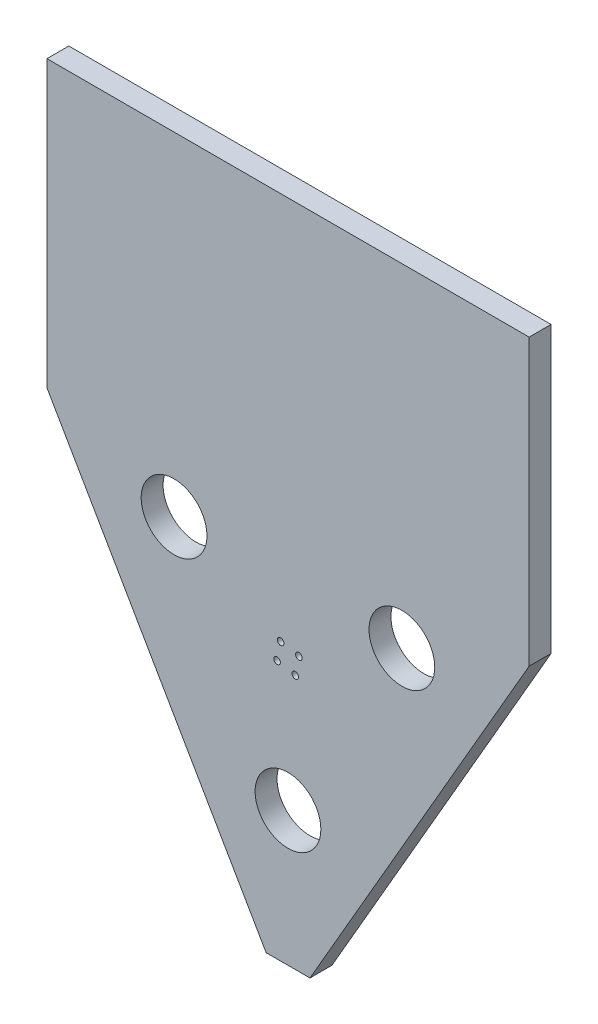
ISO-10303-21;
HEADER;
FILE_DESCRIPTION(('STEP AP214'),'2;1');
FILE_NAME('part.step','',(''),(''),'','','');
FILE_SCHEMA(('AUTOMOTIVE_DESIGN { 1 0 10303 214 1 1 1 1 }'));
ENDSEC;
DATA;
#1=APPLICATION_CONTEXT('core data for automotive mechanical design processes');
#2=APPLICATION_PROTOCOL_DEFINITION('international standard','automotive_design',2000,#1);
#3=PRODUCT_CONTEXT('',#1,'mechanical');
#4=PRODUCT('Part','Part','',(#3));
#5=PRODUCT_RELATED_PRODUCT_CATEGORY('part','',(#4));
#6=PRODUCT_DEFINITION_FORMATION('','',#4);
#7=PRODUCT_DEFINITION_CONTEXT('part definition',#1,'design');
#8=PRODUCT_DEFINITION('design','',#6,#7);
#9=PRODUCT_DEFINITION_SHAPE('','',#8);
#10=(LENGTH_UNIT() NAMED_UNIT(*) SI_UNIT(.MILLI.,.METRE.));
#11=(NAMED_UNIT(*) PLANE_ANGLE_UNIT() SI_UNIT($,.RADIAN.));
#12=(NAMED_UNIT(*) SI_UNIT($,.STERADIAN.) SOLID_ANGLE_UNIT());
#13=UNCERTAINTY_MEASURE_WITH_UNIT(LENGTH_MEASURE(1.E-05),#10,'distance_accuracy_value','');
#14=(GEOMETRIC_REPRESENTATION_CONTEXT(3) GLOBAL_UNCERTAINTY_ASSIGNED_CONTEXT((#13)) GLOBAL_UNIT_ASSIGNED_CONTEXT((#10,
#11,#12)) REPRESENTATION_CONTEXT('',''));
#15=CARTESIAN_POINT('',(0.,0.,0.));
#16=DIRECTION('',(0.,0.,1.));
#17=DIRECTION('',(1.,0.,0.));
#18=AXIS2_PLACEMENT_3D('',#15,#16,#17);
#19=CARTESIAN_POINT('',(-197.117835219832,113.806035226242,10.));
#20=DIRECTION('',(0.866025403784447,-0.499999999999986,0.));
#21=DIRECTION('',(0.499999999999986,0.866025403784447,0.));
#22=AXIS2_PLACEMENT_3D('',#19,#20,#21);
#23=PLANE('',#22);
#24=DIRECTION('',(-0.499999999999986,-0.866025403784447,0.));
#25=VECTOR('',#24,1.);
#26=CARTESIAN_POINT('',(-197.117835219832,113.806035226242,0.));
#27=LINE('',#26,#25);
#28=CARTESIAN_POINT('',(-349.776309556902,-150.606198531524,0.));
#29=VERTEX_POINT('',#28);
#30=CARTESIAN_POINT('',(-449.7763095569,-323.811279288413,0.));
#31=VERTEX_POINT('',#30);
#32=EDGE_CURVE('E143',#29,#31,#27,.T.);
#33=ORIENTED_EDGE('',*,*,#32,.F.);
#34=DIRECTION('',(0.,0.,-1.));
#35=VECTOR('',#34,1.);
#36=CARTESIAN_POINT('',(-349.776309556902,-150.606198531524,10.));
#37=LINE('',#36,#35);
#38=CARTESIAN_POINT('',(-349.776309556902,-150.606198531524,10.));
#39=VERTEX_POINT('',#38);
#40=EDGE_CURVE('E11',#39,#29,#37,.T.);
#41=ORIENTED_EDGE('',*,*,#40,.F.);
#42=DIRECTION('',(-0.499999999999986,-0.866025403784447,0.));
#43=VECTOR('',#42,1.);
#44=CARTESIAN_POINT('',(-197.117835219832,113.806035226242,10.));
#45=LINE('',#44,#43);
#46=CARTESIAN_POINT('',(-449.7763095569,-323.811279288413,10.));
#47=VERTEX_POINT('',#46);
#48=EDGE_CURVE('E355',#39,#47,#45,.T.);
#49=ORIENTED_EDGE('',*,*,#48,.T.);
#50=DIRECTION('',(0.,0.,-1.));
#51=VECTOR('',#50,1.);
#52=CARTESIAN_POINT('',(-449.7763095569,-323.811279288413,10.));
#53=LINE('',#52,#51);
#54=EDGE_CURVE('E56',#47,#31,#53,.T.);
#55=ORIENTED_EDGE('',*,*,#54,.T.);
#56=EDGE_LOOP('',(#33,#41,#49,#55));
#57=FACE_BOUND('',#56,.T.);
#58=ADVANCED_FACE('F39',(#57),#23,.T.);
#59=CARTESIAN_POINT('',(-349.776309556902,0.,10.));
#60=DIRECTION('',(-1.,0.,0.));
#61=DIRECTION('',(0.,0.,1.));
#62=AXIS2_PLACEMENT_3D('',#59,#60,#61);
#63=PLANE('',#62);
#64=DIRECTION('',(0.,1.,0.));
#65=VECTOR('',#64,1.);
#66=CARTESIAN_POINT('',(-349.776309556902,0.,0.));
#67=LINE('',#66,#65);
#68=CARTESIAN_POINT('',(-349.776309556902,-20.6061985315242,0.));
#69=VERTEX_POINT('',#68);
#70=EDGE_CURVE('E145',#29,#69,#67,.T.);
#71=ORIENTED_EDGE('',*,*,#70,.T.);
#72=DIRECTION('',(0.,0.,-1.));
#73=VECTOR('',#72,1.);
#74=CARTESIAN_POINT('',(-349.776309556902,-20.6061985315242,10.));
#75=LINE('',#74,#73);
#76=CARTESIAN_POINT('',(-349.776309556902,-20.6061985315242,10.));
#77=VERTEX_POINT('',#76);
#78=EDGE_CURVE('E48',#77,#69,#75,.T.);
#79=ORIENTED_EDGE('',*,*,#78,.F.);
#80=DIRECTION('',(0.,1.,0.));
#81=VECTOR('',#80,1.);
#82=CARTESIAN_POINT('',(-349.776309556902,0.,10.));
#83=LINE('',#82,#81);
#84=EDGE_CURVE('E357',#39,#77,#83,.T.);
#85=ORIENTED_EDGE('',*,*,#84,.F.);
#86=ORIENTED_EDGE('',*,*,#40,.T.);
#87=EDGE_LOOP('',(#71,#79,#85,#86));
#88=FACE_BOUND('',#87,.T.);
#89=ADVANCED_FACE('F178',(#88),#63,.F.);
#90=CARTESIAN_POINT('',(0.,-20.6061985315242,10.));
#91=DIRECTION('',(0.,1.,0.));
#92=DIRECTION('',(0.,0.,1.));
#93=AXIS2_PLACEMENT_3D('',#90,#91,#92);
#94=PLANE('',#93);
#95=DIRECTION('',(1.,0.,0.));
#96=VECTOR('',#95,1.);
#97=CARTESIAN_POINT('',(0.,-20.6061985315242,0.));
#98=LINE('',#97,#96);
#99=CARTESIAN_POINT('',(-569.776309556896,-20.6061985315242,0.));
#100=VERTEX_POINT('',#99);
#101=EDGE_CURVE('E148',#100,#69,#98,.T.);
#102=ORIENTED_EDGE('',*,*,#101,.F.);
#103=DIRECTION('',(0.,0.,-1.));
#104=VECTOR('',#103,1.);
#105=CARTESIAN_POINT('',(-569.776309556896,-20.6061985315242,10.));
#106=LINE('',#105,#104);
#107=CARTESIAN_POINT('',(-569.776309556896,-20.6061985315242,10.));
#108=VERTEX_POINT('',#107);
#109=EDGE_CURVE('E103',#108,#100,#106,.T.);
#110=ORIENTED_EDGE('',*,*,#109,.F.);
#111=DIRECTION('',(1.,0.,0.));
#112=VECTOR('',#111,1.);
#113=CARTESIAN_POINT('',(0.,-20.6061985315242,10.));
#114=LINE('',#113,#112);
#115=EDGE_CURVE('E114',#108,#77,#114,.T.);
#116=ORIENTED_EDGE('',*,*,#115,.T.);
#117=ORIENTED_EDGE('',*,*,#78,.T.);
#118=EDGE_LOOP('',(#102,#110,#116,#117));
#119=FACE_BOUND('',#118,.T.);
#120=ADVANCED_FACE('F175',(#119),#94,.T.);
#121=CARTESIAN_POINT('',(-569.776309556896,0.,10.));
#122=DIRECTION('',(-1.,0.,0.));
#123=DIRECTION('',(0.,0.,1.));
#124=AXIS2_PLACEMENT_3D('',#121,#122,#123);
#125=PLANE('',#124);
#126=DIRECTION('',(0.,1.,0.));
#127=VECTOR('',#126,1.);
#128=CARTESIAN_POINT('',(-569.776309556896,0.,0.));
#129=LINE('',#128,#127);
#130=CARTESIAN_POINT('',(-569.776309556896,-150.606198531524,0.));
#131=VERTEX_POINT('',#130);
#132=EDGE_CURVE('E99',#131,#100,#129,.T.);
#133=ORIENTED_EDGE('',*,*,#132,.F.);
#134=DIRECTION('',(0.,0.,-1.));
#135=VECTOR('',#134,1.);
#136=CARTESIAN_POINT('',(-569.776309556896,-150.606198531524,10.));
#137=LINE('',#136,#135);
#138=CARTESIAN_POINT('',(-569.776309556896,-150.606198531524,10.));
#139=VERTEX_POINT('',#138);
#140=EDGE_CURVE('E94',#139,#131,#137,.T.);
#141=ORIENTED_EDGE('',*,*,#140,.F.);
#142=DIRECTION('',(0.,1.,0.));
#143=VECTOR('',#142,1.);
#144=CARTESIAN_POINT('',(-569.776309556896,0.,10.));
#145=LINE('',#144,#143);
#146=EDGE_CURVE('E97',#139,#108,#145,.T.);
#147=ORIENTED_EDGE('',*,*,#146,.T.);
#148=ORIENTED_EDGE('',*,*,#109,.T.);
#149=EDGE_LOOP('',(#133,#141,#147,#148));
#150=FACE_BOUND('',#149,.T.);
#151=ADVANCED_FACE('F96',(#150),#125,.T.);
#152=CARTESIAN_POINT('',(-492.546629115532,-284.371928908281,10.));
#153=DIRECTION('',(-0.86602540378445,-0.499999999999981,0.));
#154=DIRECTION('',(0.499999999999981,-0.86602540378445,0.));
#155=AXIS2_PLACEMENT_3D('',#152,#153,#154);
#156=PLANE('',#155);
#157=DIRECTION('',(-0.499999999999981,0.86602540378445,0.));
#158=VECTOR('',#157,1.);
#159=CARTESIAN_POINT('',(-492.546629115532,-284.371928908281,0.));
#160=LINE('',#159,#158);
#161=CARTESIAN_POINT('',(-469.7763095569,-323.811279288414,0.));
#162=VERTEX_POINT('',#161);
#163=EDGE_CURVE('E152',#162,#131,#160,.T.);
#164=ORIENTED_EDGE('',*,*,#163,.F.);
#165=DIRECTION('',(0.,0.,-1.));
#166=VECTOR('',#165,1.);
#167=CARTESIAN_POINT('',(-469.7763095569,-323.811279288414,10.));
#168=LINE('',#167,#166);
#169=CARTESIAN_POINT('',(-469.7763095569,-323.811279288414,10.));
#170=VERTEX_POINT('',#169);
#171=EDGE_CURVE('E75',#170,#162,#168,.T.);
#172=ORIENTED_EDGE('',*,*,#171,.F.);
#173=DIRECTION('',(-0.499999999999981,0.86602540378445,0.));
#174=VECTOR('',#173,1.);
#175=CARTESIAN_POINT('',(-492.546629115532,-284.371928908281,10.));
#176=LINE('',#175,#174);
#177=EDGE_CURVE('E112',#170,#139,#176,.T.);
#178=ORIENTED_EDGE('',*,*,#177,.T.);
#179=ORIENTED_EDGE('',*,*,#140,.T.);
#180=EDGE_LOOP('',(#164,#172,#178,#179));
#181=FACE_BOUND('',#180,.T.);
#182=ADVANCED_FACE('F116',(#181),#156,.T.);
#183=CARTESIAN_POINT('',(-454.824757902039,-199.244000664377,10.));
#184=DIRECTION('',(0.,0.,-1.));
#185=DIRECTION('',(-1.,0.,0.));
#186=AXIS2_PLACEMENT_3D('',#183,#184,#185);
#187=CYLINDRICAL_SURFACE('',#186,1.50000000000002);
#188=CARTESIAN_POINT('',(-454.824757902039,-199.244000664377,10.));
#189=DIRECTION('',(0.,0.,1.));
#190=DIRECTION('',(1.,0.,0.));
#191=AXIS2_PLACEMENT_3D('',#188,#189,#190);
#192=CIRCLE('',#191,1.50000000000002);
#193=CARTESIAN_POINT('',(-453.324757902039,-199.244000664377,10.));
#194=VERTEX_POINT('',#193);
#195=EDGE_CURVE('E128',#194,#194,#192,.T.);
#196=ORIENTED_EDGE('',*,*,#195,.T.);
#197=EDGE_LOOP('',(#196));
#198=FACE_BOUND('',#197,.T.);
#199=CARTESIAN_POINT('',(-454.824757902039,-199.244000664377,0.));
#200=DIRECTION('',(0.,0.,1.));
#201=DIRECTION('',(1.,0.,0.));
#202=AXIS2_PLACEMENT_3D('',#199,#200,#201);
#203=CIRCLE('',#202,1.50000000000002);
#204=CARTESIAN_POINT('',(-453.324757902039,-199.244000664377,0.));
#205=VERTEX_POINT('',#204);
#206=EDGE_CURVE('E163',#205,#205,#203,.T.);
#207=ORIENTED_EDGE('',*,*,#206,.F.);
#208=EDGE_LOOP('',(#207));
#209=FACE_BOUND('',#208,.T.);
#210=ADVANCED_FACE('F233',(#198,#209),#187,.F.);
#211=CARTESIAN_POINT('',(-456.465926698564,-207.569057119519,10.));
#212=DIRECTION('',(0.,0.,-1.));
#213=DIRECTION('',(-1.,0.,0.));
#214=AXIS2_PLACEMENT_3D('',#211,#212,#213);
#215=CYLINDRICAL_SURFACE('',#214,1.50000000000002);
#216=CARTESIAN_POINT('',(-456.465926698564,-207.569057119519,10.));
#217=DIRECTION('',(0.,0.,1.));
#218=DIRECTION('',(1.,0.,0.));
#219=AXIS2_PLACEMENT_3D('',#216,#217,#218);
#220=CIRCLE('',#219,1.50000000000002);
#221=CARTESIAN_POINT('',(-454.965926698564,-207.569057119519,10.));
#222=VERTEX_POINT('',#221);
#223=EDGE_CURVE('E125',#222,#222,#220,.T.);
#224=ORIENTED_EDGE('',*,*,#223,.T.);
#225=EDGE_LOOP('',(#224));
#226=FACE_BOUND('',#225,.T.);
#227=CARTESIAN_POINT('',(-456.465926698564,-207.569057119519,0.));
#228=DIRECTION('',(0.,0.,1.));
#229=DIRECTION('',(1.,0.,0.));
#230=AXIS2_PLACEMENT_3D('',#227,#228,#229);
#231=CIRCLE('',#230,1.50000000000002);
#232=CARTESIAN_POINT('',(-454.965926698564,-207.569057119519,0.));
#233=VERTEX_POINT('',#232);
#234=EDGE_CURVE('E160',#233,#233,#231,.T.);
#235=ORIENTED_EDGE('',*,*,#234,.F.);
#236=EDGE_LOOP('',(#235));
#237=FACE_BOUND('',#236,.T.);
#238=ADVANCED_FACE('F194',(#226,#237),#215,.F.);
#239=CARTESIAN_POINT('',(-464.790983153707,-205.927888322994,10.));
#240=DIRECTION('',(0.,0.,-1.));
#241=DIRECTION('',(-1.,0.,0.));
#242=AXIS2_PLACEMENT_3D('',#239,#240,#241);
#243=CYLINDRICAL_SURFACE('',#242,1.50000000000002);
#244=CARTESIAN_POINT('',(-464.790983153707,-205.927888322994,10.));
#245=DIRECTION('',(0.,0.,1.));
#246=DIRECTION('',(1.,0.,0.));
#247=AXIS2_PLACEMENT_3D('',#244,#245,#246);
#248=CIRCLE('',#247,1.50000000000002);
#249=CARTESIAN_POINT('',(-463.290983153707,-205.927888322994,10.));
#250=VERTEX_POINT('',#249);
#251=EDGE_CURVE('E119',#250,#250,#248,.T.);
#252=ORIENTED_EDGE('',*,*,#251,.T.);
#253=EDGE_LOOP('',(#252));
#254=FACE_BOUND('',#253,.T.);
#255=CARTESIAN_POINT('',(-464.790983153707,-205.927888322994,0.));
#256=DIRECTION('',(0.,0.,1.));
#257=DIRECTION('',(1.,0.,0.));
#258=AXIS2_PLACEMENT_3D('',#255,#256,#257);
#259=CIRCLE('',#258,1.50000000000002);
#260=CARTESIAN_POINT('',(-463.290983153707,-205.927888322994,0.));
#261=VERTEX_POINT('',#260);
#262=EDGE_CURVE('E157',#261,#261,#259,.T.);
#263=ORIENTED_EDGE('',*,*,#262,.F.);
#264=EDGE_LOOP('',(#263));
#265=FACE_BOUND('',#264,.T.);
#266=ADVANCED_FACE('F185',(#254,#265),#243,.F.);
#267=CARTESIAN_POINT('',(7.19005475798628E-12,-323.811279288403,10.));
#268=DIRECTION('',(0.,-1.,0.));
#269=DIRECTION('',(1.,0.,0.));
#270=AXIS2_PLACEMENT_3D('',#267,#268,#269);
#271=PLANE('',#270);
#272=DIRECTION('',(-1.,0.,0.));
#273=VECTOR('',#272,1.);
#274=CARTESIAN_POINT('',(7.19005475798628E-12,-323.811279288403,0.));
#275=LINE('',#274,#273);
#276=EDGE_CURVE('E154',#31,#162,#275,.T.);
#277=ORIENTED_EDGE('',*,*,#276,.F.);
#278=ORIENTED_EDGE('',*,*,#54,.F.);
#279=DIRECTION('',(-1.,0.,0.));
#280=VECTOR('',#279,1.);
#281=CARTESIAN_POINT('',(7.19005475798628E-12,-323.811279288403,10.));
#282=LINE('',#281,#280);
#283=EDGE_CURVE('E117',#47,#170,#282,.T.);
#284=ORIENTED_EDGE('',*,*,#283,.T.);
#285=ORIENTED_EDGE('',*,*,#171,.T.);
#286=EDGE_LOOP('',(#277,#278,#284,#285));
#287=FACE_BOUND('',#286,.T.);
#288=ADVANCED_FACE('F182',(#287),#271,.T.);
#289=CARTESIAN_POINT('',(-407.846346300803,-172.585944493692,10.));
#290=DIRECTION('',(0.,0.,-1.));
#291=DIRECTION('',(-1.,0.,0.));
#292=AXIS2_PLACEMENT_3D('',#289,#290,#291);
#293=CYLINDRICAL_SURFACE('',#292,15.);
#294=CARTESIAN_POINT('',(-407.846346300803,-172.585944493692,10.));
#295=DIRECTION('',(0.,0.,1.));
#296=DIRECTION('',(1.,0.,0.));
#297=AXIS2_PLACEMENT_3D('',#294,#295,#296);
#298=CIRCLE('',#297,15.);
#299=CARTESIAN_POINT('',(-392.846346300803,-172.585944493692,10.));
#300=VERTEX_POINT('',#299);
#301=EDGE_CURVE('E354',#300,#300,#298,.T.);
#302=ORIENTED_EDGE('',*,*,#301,.T.);
#303=EDGE_LOOP('',(#302));
#304=FACE_BOUND('',#303,.T.);
#305=CARTESIAN_POINT('',(-407.846346300803,-172.585944493692,0.));
#306=DIRECTION('',(0.,0.,1.));
#307=DIRECTION('',(1.,0.,0.));
#308=AXIS2_PLACEMENT_3D('',#305,#306,#307);
#309=CIRCLE('',#308,15.);
#310=CARTESIAN_POINT('',(-392.846346300803,-172.585944493692,0.));
#311=VERTEX_POINT('',#310);
#312=EDGE_CURVE('E140',#311,#311,#309,.T.);
#313=ORIENTED_EDGE('',*,*,#312,.F.);
#314=EDGE_LOOP('',(#313));
#315=FACE_BOUND('',#314,.T.);
#316=ADVANCED_FACE('F184',(#304,#315),#293,.F.);
#317=CARTESIAN_POINT('',(-511.769394754935,-172.585944493686,10.));
#318=DIRECTION('',(0.,0.,-1.));
#319=DIRECTION('',(-1.,0.,0.));
#320=AXIS2_PLACEMENT_3D('',#317,#318,#319);
#321=CYLINDRICAL_SURFACE('',#320,15.);
#322=CARTESIAN_POINT('',(-511.769394754935,-172.585944493686,10.));
#323=DIRECTION('',(0.,0.,1.));
#324=DIRECTION('',(1.,0.,0.));
#325=AXIS2_PLACEMENT_3D('',#322,#323,#324);
#326=CIRCLE('',#325,15.);
#327=CARTESIAN_POINT('',(-496.769394754935,-172.585944493686,10.));
#328=VERTEX_POINT('',#327);
#329=EDGE_CURVE('E215',#328,#328,#326,.T.);
#330=ORIENTED_EDGE('',*,*,#329,.T.);
#331=EDGE_LOOP('',(#330));
#332=FACE_BOUND('',#331,.T.);
#333=CARTESIAN_POINT('',(-511.769394754935,-172.585944493686,0.));
#334=DIRECTION('',(0.,0.,1.));
#335=DIRECTION('',(1.,0.,0.));
#336=AXIS2_PLACEMENT_3D('',#333,#334,#335);
#337=CIRCLE('',#336,15.);
#338=CARTESIAN_POINT('',(-496.769394754935,-172.585944493686,0.));
#339=VERTEX_POINT('',#338);
#340=EDGE_CURVE('E137',#339,#339,#337,.T.);
#341=ORIENTED_EDGE('',*,*,#340,.F.);
#342=EDGE_LOOP('',(#341));
#343=FACE_BOUND('',#342,.T.);
#344=ADVANCED_FACE('F191',(#332,#343),#321,.F.);
#345=CARTESIAN_POINT('',(-459.807870527874,-262.585944493689,10.));
#346=DIRECTION('',(0.,0.,-1.));
#347=DIRECTION('',(-1.,0.,0.));
#348=AXIS2_PLACEMENT_3D('',#345,#346,#347);
#349=CYLINDRICAL_SURFACE('',#348,15.);
#350=CARTESIAN_POINT('',(-459.807870527874,-262.585944493689,10.));
#351=DIRECTION('',(0.,0.,1.));
#352=DIRECTION('',(1.,0.,0.));
#353=AXIS2_PLACEMENT_3D('',#350,#351,#352);
#354=CIRCLE('',#353,15.);
#355=CARTESIAN_POINT('',(-444.807870527874,-262.585944493689,10.));
#356=VERTEX_POINT('',#355);
#357=EDGE_CURVE('E169',#356,#356,#354,.T.);
#358=ORIENTED_EDGE('',*,*,#357,.T.);
#359=EDGE_LOOP('',(#358));
#360=FACE_BOUND('',#359,.T.);
#361=CARTESIAN_POINT('',(-459.807870527874,-262.585944493689,0.));
#362=DIRECTION('',(0.,0.,1.));
#363=DIRECTION('',(1.,0.,0.));
#364=AXIS2_PLACEMENT_3D('',#361,#362,#363);
#365=CIRCLE('',#364,15.);
#366=CARTESIAN_POINT('',(-444.807870527874,-262.585944493689,0.));
#367=VERTEX_POINT('',#366);
#368=EDGE_CURVE('E134',#367,#367,#365,.T.);
#369=ORIENTED_EDGE('',*,*,#368,.F.);
#370=EDGE_LOOP('',(#369));
#371=FACE_BOUND('',#370,.T.);
#372=ADVANCED_FACE('F41',(#360,#371),#349,.F.);
#373=CARTESIAN_POINT('',(-463.149814357182,-197.602831867852,10.));
#374=DIRECTION('',(0.,0.,-1.));
#375=DIRECTION('',(-1.,0.,0.));
#376=AXIS2_PLACEMENT_3D('',#373,#374,#375);
#377=CYLINDRICAL_SURFACE('',#376,1.50000000000002);
#378=CARTESIAN_POINT('',(-463.149814357182,-197.602831867852,10.));
#379=DIRECTION('',(0.,0.,1.));
#380=DIRECTION('',(1.,0.,0.));
#381=AXIS2_PLACEMENT_3D('',#378,#379,#380);
#382=CIRCLE('',#381,1.50000000000002);
#383=CARTESIAN_POINT('',(-461.649814357182,-197.602831867852,10.));
#384=VERTEX_POINT('',#383);
#385=EDGE_CURVE('E131',#384,#384,#382,.T.);
#386=ORIENTED_EDGE('',*,*,#385,.T.);
#387=EDGE_LOOP('',(#386));
#388=FACE_BOUND('',#387,.T.);
#389=CARTESIAN_POINT('',(-463.149814357182,-197.602831867852,0.));
#390=DIRECTION('',(0.,0.,1.));
#391=DIRECTION('',(1.,0.,0.));
#392=AXIS2_PLACEMENT_3D('',#389,#390,#391);
#393=CIRCLE('',#392,1.50000000000002);
#394=CARTESIAN_POINT('',(-461.649814357182,-197.602831867852,0.));
#395=VERTEX_POINT('',#394);
#396=EDGE_CURVE('E166',#395,#395,#393,.T.);
#397=ORIENTED_EDGE('',*,*,#396,.F.);
#398=EDGE_LOOP('',(#397));
#399=FACE_BOUND('',#398,.T.);
#400=ADVANCED_FACE('F210',(#388,#399),#377,.F.);
#401=CARTESIAN_POINT('',(0.,0.,10.));
#402=DIRECTION('',(0.,0.,1.));
#403=DIRECTION('',(1.,0.,0.));
#404=AXIS2_PLACEMENT_3D('',#401,#402,#403);
#405=PLANE('',#404);
#406=ORIENTED_EDGE('',*,*,#357,.F.);
#407=EDGE_LOOP('',(#406));
#408=FACE_BOUND('',#407,.T.);
#409=ORIENTED_EDGE('',*,*,#329,.F.);
#410=EDGE_LOOP('',(#409));
#411=FACE_BOUND('',#410,.T.);
#412=ORIENTED_EDGE('',*,*,#301,.F.);
#413=EDGE_LOOP('',(#412));
#414=FACE_BOUND('',#413,.T.);
#415=ORIENTED_EDGE('',*,*,#48,.F.);
#416=ORIENTED_EDGE('',*,*,#84,.T.);
#417=ORIENTED_EDGE('',*,*,#115,.F.);
#418=ORIENTED_EDGE('',*,*,#146,.F.);
#419=ORIENTED_EDGE('',*,*,#177,.F.);
#420=ORIENTED_EDGE('',*,*,#283,.F.);
#421=EDGE_LOOP('',(#415,#416,#417,#418,#419,#420));
#422=FACE_BOUND('',#421,.T.);
#423=ORIENTED_EDGE('',*,*,#251,.F.);
#424=EDGE_LOOP('',(#423));
#425=FACE_BOUND('',#424,.T.);
#426=ORIENTED_EDGE('',*,*,#223,.F.);
#427=EDGE_LOOP('',(#426));
#428=FACE_BOUND('',#427,.T.);
#429=ORIENTED_EDGE('',*,*,#195,.F.);
#430=EDGE_LOOP('',(#429));
#431=FACE_BOUND('',#430,.T.);
#432=ORIENTED_EDGE('',*,*,#385,.F.);
#433=EDGE_LOOP('',(#432));
#434=FACE_BOUND('',#433,.T.);
#435=ADVANCED_FACE('F109',(#408,#411,#414,#422,#425,#428,#431,#434),#405,.T.);
#436=CARTESIAN_POINT('',(0.,0.,0.));
#437=DIRECTION('',(0.,0.,1.));
#438=DIRECTION('',(1.,0.,0.));
#439=AXIS2_PLACEMENT_3D('',#436,#437,#438);
#440=PLANE('',#439);
#441=ORIENTED_EDGE('',*,*,#368,.T.);
#442=EDGE_LOOP('',(#441));
#443=FACE_BOUND('',#442,.T.);
#444=ORIENTED_EDGE('',*,*,#340,.T.);
#445=EDGE_LOOP('',(#444));
#446=FACE_BOUND('',#445,.T.);
#447=ORIENTED_EDGE('',*,*,#312,.T.);
#448=EDGE_LOOP('',(#447));
#449=FACE_BOUND('',#448,.T.);
#450=ORIENTED_EDGE('',*,*,#32,.T.);
#451=ORIENTED_EDGE('',*,*,#276,.T.);
#452=ORIENTED_EDGE('',*,*,#163,.T.);
#453=ORIENTED_EDGE('',*,*,#132,.T.);
#454=ORIENTED_EDGE('',*,*,#101,.T.);
#455=ORIENTED_EDGE('',*,*,#70,.F.);
#456=EDGE_LOOP('',(#450,#451,#452,#453,#454,#455));
#457=FACE_BOUND('',#456,.T.);
#458=ORIENTED_EDGE('',*,*,#262,.T.);
#459=EDGE_LOOP('',(#458));
#460=FACE_BOUND('',#459,.T.);
#461=ORIENTED_EDGE('',*,*,#234,.T.);
#462=EDGE_LOOP('',(#461));
#463=FACE_BOUND('',#462,.T.);
#464=ORIENTED_EDGE('',*,*,#206,.T.);
#465=EDGE_LOOP('',(#464));
#466=FACE_BOUND('',#465,.T.);
#467=ORIENTED_EDGE('',*,*,#396,.T.);
#468=EDGE_LOOP('',(#467));
#469=FACE_BOUND('',#468,.T.);
#470=ADVANCED_FACE('F180',(#443,#446,#449,#457,#460,#463,#466,#469),#440,.F.);
#471=CLOSED_SHELL('',(#58,#89,#120,#151,#182,#210,#238,#266,#288,#316,#344,#372,#400,#435,#470));
#472=MANIFOLD_SOLID_BREP('B2',#471);
#473=ADVANCED_BREP_SHAPE_REPRESENTATION('',(#18,#472),#14);
#474=SHAPE_DEFINITION_REPRESENTATION(#9,#473);
ENDSEC;
END-ISO-10303-21;
